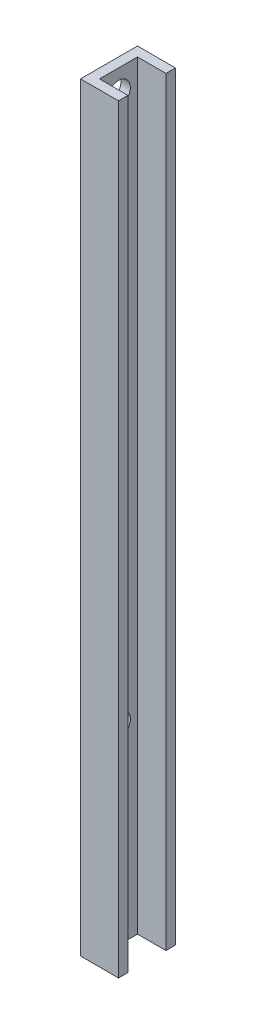
ISO-10303-21;
HEADER;
FILE_DESCRIPTION(('STEP AP214'),'2;1');
FILE_NAME('part.step','',(''),(''),'','','');
FILE_SCHEMA(('AUTOMOTIVE_DESIGN { 1 0 10303 214 1 1 1 1 }'));
ENDSEC;
DATA;
#1=APPLICATION_CONTEXT('core data for automotive mechanical design processes');
#2=APPLICATION_PROTOCOL_DEFINITION('international standard','automotive_design',2000,#1);
#3=PRODUCT_CONTEXT('',#1,'mechanical');
#4=PRODUCT('Part','Part','',(#3));
#5=PRODUCT_RELATED_PRODUCT_CATEGORY('part','',(#4));
#6=PRODUCT_DEFINITION_FORMATION('','',#4);
#7=PRODUCT_DEFINITION_CONTEXT('part definition',#1,'design');
#8=PRODUCT_DEFINITION('design','',#6,#7);
#9=PRODUCT_DEFINITION_SHAPE('','',#8);
#10=(LENGTH_UNIT() NAMED_UNIT(*) SI_UNIT(.MILLI.,.METRE.));
#11=(NAMED_UNIT(*) PLANE_ANGLE_UNIT() SI_UNIT($,.RADIAN.));
#12=(NAMED_UNIT(*) SI_UNIT($,.STERADIAN.) SOLID_ANGLE_UNIT());
#13=UNCERTAINTY_MEASURE_WITH_UNIT(LENGTH_MEASURE(1.E-05),#10,'distance_accuracy_value','');
#14=(GEOMETRIC_REPRESENTATION_CONTEXT(3) GLOBAL_UNCERTAINTY_ASSIGNED_CONTEXT((#13)) GLOBAL_UNIT_ASSIGNED_CONTEXT((#10,
#11,#12)) REPRESENTATION_CONTEXT('',''));
#15=CARTESIAN_POINT('',(0.,0.,0.));
#16=DIRECTION('',(0.,0.,1.));
#17=DIRECTION('',(1.,0.,0.));
#18=AXIS2_PLACEMENT_3D('',#15,#16,#17);
#19=CARTESIAN_POINT('',(0.,254.,-19.05));
#20=DIRECTION('',(1.,0.,0.));
#21=DIRECTION('',(0.,0.,-1.));
#22=AXIS2_PLACEMENT_3D('',#19,#20,#21);
#23=PLANE('',#22);
#24=CARTESIAN_POINT('',(0.,246.38,-9.525));
#25=DIRECTION('',(1.,0.,0.));
#26=DIRECTION('',(0.,0.,-1.));
#27=AXIS2_PLACEMENT_3D('',#24,#25,#26);
#28=CIRCLE('',#27,3.96875);
#29=CARTESIAN_POINT('',(0.,246.38,-13.49375));
#30=VERTEX_POINT('',#29);
#31=EDGE_CURVE('E182',#30,#30,#28,.T.);
#32=ORIENTED_EDGE('',*,*,#31,.T.);
#33=EDGE_LOOP('',(#32));
#34=FACE_BOUND('',#33,.T.);
#35=CARTESIAN_POINT('',(0.,63.5,-9.525));
#36=DIRECTION('',(1.,0.,0.));
#37=DIRECTION('',(0.,0.,-1.));
#38=AXIS2_PLACEMENT_3D('',#35,#36,#37);
#39=CIRCLE('',#38,3.96875);
#40=CARTESIAN_POINT('',(0.,63.5,-13.49375));
#41=VERTEX_POINT('',#40);
#42=EDGE_CURVE('E133',#41,#41,#39,.T.);
#43=ORIENTED_EDGE('',*,*,#42,.T.);
#44=EDGE_LOOP('',(#43));
#45=FACE_BOUND('',#44,.T.);
#46=DIRECTION('',(0.,0.,1.));
#47=VECTOR('',#46,1.);
#48=CARTESIAN_POINT('',(0.,0.,-19.05));
#49=LINE('',#48,#47);
#50=CARTESIAN_POINT('',(0.,0.,-19.05));
#51=VERTEX_POINT('',#50);
#52=CARTESIAN_POINT('',(0.,0.,0.));
#53=VERTEX_POINT('',#52);
#54=EDGE_CURVE('E129',#51,#53,#49,.T.);
#55=ORIENTED_EDGE('',*,*,#54,.T.);
#56=DIRECTION('',(0.,-1.,0.));
#57=VECTOR('',#56,1.);
#58=CARTESIAN_POINT('',(0.,254.,0.));
#59=LINE('',#58,#57);
#60=CARTESIAN_POINT('',(0.,254.,0.));
#61=VERTEX_POINT('',#60);
#62=EDGE_CURVE('E11',#61,#53,#59,.T.);
#63=ORIENTED_EDGE('',*,*,#62,.F.);
#64=DIRECTION('',(0.,0.,1.));
#65=VECTOR('',#64,1.);
#66=CARTESIAN_POINT('',(0.,254.,-19.05));
#67=LINE('',#66,#65);
#68=CARTESIAN_POINT('',(0.,254.,-19.05));
#69=VERTEX_POINT('',#68);
#70=EDGE_CURVE('E144',#69,#61,#67,.T.);
#71=ORIENTED_EDGE('',*,*,#70,.F.);
#72=DIRECTION('',(0.,-1.,0.));
#73=VECTOR('',#72,1.);
#74=CARTESIAN_POINT('',(0.,254.,-19.05));
#75=LINE('',#74,#73);
#76=EDGE_CURVE('E125',#69,#51,#75,.T.);
#77=ORIENTED_EDGE('',*,*,#76,.T.);
#78=EDGE_LOOP('',(#55,#63,#71,#77));
#79=FACE_BOUND('',#78,.T.);
#80=ADVANCED_FACE('F33',(#34,#45,#79),#23,.F.);
#81=CARTESIAN_POINT('',(0.,254.,0.));
#82=DIRECTION('',(0.,0.,-1.));
#83=DIRECTION('',(-1.,0.,0.));
#84=AXIS2_PLACEMENT_3D('',#81,#82,#83);
#85=PLANE('',#84);
#86=DIRECTION('',(1.,0.,0.));
#87=VECTOR('',#86,1.);
#88=CARTESIAN_POINT('',(0.,0.,0.));
#89=LINE('',#88,#87);
#90=CARTESIAN_POINT('',(12.7,0.,0.));
#91=VERTEX_POINT('',#90);
#92=EDGE_CURVE('E132',#53,#91,#89,.T.);
#93=ORIENTED_EDGE('',*,*,#92,.T.);
#94=DIRECTION('',(0.,-1.,0.));
#95=VECTOR('',#94,1.);
#96=CARTESIAN_POINT('',(12.7,254.,0.));
#97=LINE('',#96,#95);
#98=CARTESIAN_POINT('',(12.7,254.,0.));
#99=VERTEX_POINT('',#98);
#100=EDGE_CURVE('E41',#99,#91,#97,.T.);
#101=ORIENTED_EDGE('',*,*,#100,.F.);
#102=DIRECTION('',(1.,0.,0.));
#103=VECTOR('',#102,1.);
#104=CARTESIAN_POINT('',(0.,254.,0.));
#105=LINE('',#104,#103);
#106=EDGE_CURVE('E92',#61,#99,#105,.T.);
#107=ORIENTED_EDGE('',*,*,#106,.F.);
#108=ORIENTED_EDGE('',*,*,#62,.T.);
#109=EDGE_LOOP('',(#93,#101,#107,#108));
#110=FACE_BOUND('',#109,.T.);
#111=ADVANCED_FACE('F205',(#110),#85,.F.);
#112=CARTESIAN_POINT('',(12.7,254.,0.));
#113=DIRECTION('',(-1.,0.,0.));
#114=DIRECTION('',(0.,0.,1.));
#115=AXIS2_PLACEMENT_3D('',#112,#113,#114);
#116=PLANE('',#115);
#117=DIRECTION('',(0.,0.,-1.));
#118=VECTOR('',#117,1.);
#119=CARTESIAN_POINT('',(12.7,0.,0.));
#120=LINE('',#119,#118);
#121=CARTESIAN_POINT('',(12.7,0.,-3.175));
#122=VERTEX_POINT('',#121);
#123=EDGE_CURVE('E135',#91,#122,#120,.T.);
#124=ORIENTED_EDGE('',*,*,#123,.T.);
#125=DIRECTION('',(0.,-1.,0.));
#126=VECTOR('',#125,1.);
#127=CARTESIAN_POINT('',(12.7,254.,-3.175));
#128=LINE('',#127,#126);
#129=CARTESIAN_POINT('',(12.7,254.,-3.175));
#130=VERTEX_POINT('',#129);
#131=EDGE_CURVE('E151',#130,#122,#128,.T.);
#132=ORIENTED_EDGE('',*,*,#131,.F.);
#133=DIRECTION('',(0.,0.,-1.));
#134=VECTOR('',#133,1.);
#135=CARTESIAN_POINT('',(12.7,254.,0.));
#136=LINE('',#135,#134);
#137=EDGE_CURVE('E159',#99,#130,#136,.T.);
#138=ORIENTED_EDGE('',*,*,#137,.F.);
#139=ORIENTED_EDGE('',*,*,#100,.T.);
#140=EDGE_LOOP('',(#124,#132,#138,#139));
#141=FACE_BOUND('',#140,.T.);
#142=ADVANCED_FACE('F157',(#141),#116,.F.);
#143=CARTESIAN_POINT('',(12.7,254.,-3.175));
#144=DIRECTION('',(0.,0.,1.));
#145=DIRECTION('',(1.,0.,0.));
#146=AXIS2_PLACEMENT_3D('',#143,#144,#145);
#147=PLANE('',#146);
#148=DIRECTION('',(-1.,0.,0.));
#149=VECTOR('',#148,1.);
#150=CARTESIAN_POINT('',(12.7,0.,-3.175));
#151=LINE('',#150,#149);
#152=CARTESIAN_POINT('',(3.175,0.,-3.175));
#153=VERTEX_POINT('',#152);
#154=EDGE_CURVE('E137',#122,#153,#151,.T.);
#155=ORIENTED_EDGE('',*,*,#154,.T.);
#156=DIRECTION('',(0.,-1.,0.));
#157=VECTOR('',#156,1.);
#158=CARTESIAN_POINT('',(3.175,254.,-3.175));
#159=LINE('',#158,#157);
#160=CARTESIAN_POINT('',(3.175,254.,-3.175));
#161=VERTEX_POINT('',#160);
#162=EDGE_CURVE('E148',#161,#153,#159,.T.);
#163=ORIENTED_EDGE('',*,*,#162,.F.);
#164=DIRECTION('',(-1.,0.,0.));
#165=VECTOR('',#164,1.);
#166=CARTESIAN_POINT('',(12.7,254.,-3.175));
#167=LINE('',#166,#165);
#168=EDGE_CURVE('E171',#130,#161,#167,.T.);
#169=ORIENTED_EDGE('',*,*,#168,.F.);
#170=ORIENTED_EDGE('',*,*,#131,.T.);
#171=EDGE_LOOP('',(#155,#163,#169,#170));
#172=FACE_BOUND('',#171,.T.);
#173=ADVANCED_FACE('F167',(#172),#147,.F.);
#174=CARTESIAN_POINT('',(3.175,254.,-3.175));
#175=DIRECTION('',(-1.,0.,0.));
#176=DIRECTION('',(0.,0.,1.));
#177=AXIS2_PLACEMENT_3D('',#174,#175,#176);
#178=PLANE('',#177);
#179=CARTESIAN_POINT('',(3.175,246.38,-9.525));
#180=DIRECTION('',(1.,0.,0.));
#181=DIRECTION('',(0.,0.,-1.));
#182=AXIS2_PLACEMENT_3D('',#179,#180,#181);
#183=CIRCLE('',#182,3.96875);
#184=CARTESIAN_POINT('',(3.175,246.38,-13.49375));
#185=VERTEX_POINT('',#184);
#186=EDGE_CURVE('E185',#185,#185,#183,.T.);
#187=ORIENTED_EDGE('',*,*,#186,.F.);
#188=EDGE_LOOP('',(#187));
#189=FACE_BOUND('',#188,.T.);
#190=CARTESIAN_POINT('',(3.175,63.5,-9.525));
#191=DIRECTION('',(1.,0.,0.));
#192=DIRECTION('',(0.,0.,-1.));
#193=AXIS2_PLACEMENT_3D('',#190,#191,#192);
#194=CIRCLE('',#193,3.96875);
#195=CARTESIAN_POINT('',(3.175,63.5,-13.49375));
#196=VERTEX_POINT('',#195);
#197=EDGE_CURVE('E179',#196,#196,#194,.T.);
#198=ORIENTED_EDGE('',*,*,#197,.F.);
#199=EDGE_LOOP('',(#198));
#200=FACE_BOUND('',#199,.T.);
#201=DIRECTION('',(0.,0.,-1.));
#202=VECTOR('',#201,1.);
#203=CARTESIAN_POINT('',(3.175,0.,-3.175));
#204=LINE('',#203,#202);
#205=CARTESIAN_POINT('',(3.175,0.,-15.875));
#206=VERTEX_POINT('',#205);
#207=EDGE_CURVE('E139',#153,#206,#204,.T.);
#208=ORIENTED_EDGE('',*,*,#207,.T.);
#209=DIRECTION('',(0.,-1.,0.));
#210=VECTOR('',#209,1.);
#211=CARTESIAN_POINT('',(3.175,254.,-15.875));
#212=LINE('',#211,#210);
#213=CARTESIAN_POINT('',(3.175,254.,-15.875));
#214=VERTEX_POINT('',#213);
#215=EDGE_CURVE('E120',#214,#206,#212,.T.);
#216=ORIENTED_EDGE('',*,*,#215,.F.);
#217=DIRECTION('',(0.,0.,-1.));
#218=VECTOR('',#217,1.);
#219=CARTESIAN_POINT('',(3.175,254.,-3.175));
#220=LINE('',#219,#218);
#221=EDGE_CURVE('E111',#161,#214,#220,.T.);
#222=ORIENTED_EDGE('',*,*,#221,.F.);
#223=ORIENTED_EDGE('',*,*,#162,.T.);
#224=EDGE_LOOP('',(#208,#216,#222,#223));
#225=FACE_BOUND('',#224,.T.);
#226=ADVANCED_FACE('F170',(#189,#200,#225),#178,.F.);
#227=CARTESIAN_POINT('',(3.175,254.,-15.875));
#228=DIRECTION('',(0.,0.,-1.));
#229=DIRECTION('',(-1.,0.,0.));
#230=AXIS2_PLACEMENT_3D('',#227,#228,#229);
#231=PLANE('',#230);
#232=DIRECTION('',(1.,0.,0.));
#233=VECTOR('',#232,1.);
#234=CARTESIAN_POINT('',(3.175,0.,-15.875));
#235=LINE('',#234,#233);
#236=CARTESIAN_POINT('',(12.7,0.,-15.875));
#237=VERTEX_POINT('',#236);
#238=EDGE_CURVE('E119',#206,#237,#235,.T.);
#239=ORIENTED_EDGE('',*,*,#238,.T.);
#240=DIRECTION('',(0.,-1.,0.));
#241=VECTOR('',#240,1.);
#242=CARTESIAN_POINT('',(12.7,254.,-15.875));
#243=LINE('',#242,#241);
#244=CARTESIAN_POINT('',(12.7,254.,-15.875));
#245=VERTEX_POINT('',#244);
#246=EDGE_CURVE('E116',#245,#237,#243,.T.);
#247=ORIENTED_EDGE('',*,*,#246,.F.);
#248=DIRECTION('',(1.,0.,0.));
#249=VECTOR('',#248,1.);
#250=CARTESIAN_POINT('',(3.175,254.,-15.875));
#251=LINE('',#250,#249);
#252=EDGE_CURVE('E105',#214,#245,#251,.T.);
#253=ORIENTED_EDGE('',*,*,#252,.F.);
#254=ORIENTED_EDGE('',*,*,#215,.T.);
#255=EDGE_LOOP('',(#239,#247,#253,#254));
#256=FACE_BOUND('',#255,.T.);
#257=ADVANCED_FACE('F117',(#256),#231,.F.);
#258=CARTESIAN_POINT('',(12.7,254.,-15.875));
#259=DIRECTION('',(-1.,0.,0.));
#260=DIRECTION('',(0.,0.,1.));
#261=AXIS2_PLACEMENT_3D('',#258,#259,#260);
#262=PLANE('',#261);
#263=DIRECTION('',(0.,0.,-1.));
#264=VECTOR('',#263,1.);
#265=CARTESIAN_POINT('',(12.7,0.,-15.875));
#266=LINE('',#265,#264);
#267=CARTESIAN_POINT('',(12.7,0.,-19.05));
#268=VERTEX_POINT('',#267);
#269=EDGE_CURVE('E78',#237,#268,#266,.T.);
#270=ORIENTED_EDGE('',*,*,#269,.T.);
#271=DIRECTION('',(0.,-1.,0.));
#272=VECTOR('',#271,1.);
#273=CARTESIAN_POINT('',(12.7,254.,-19.05));
#274=LINE('',#273,#272);
#275=CARTESIAN_POINT('',(12.7,254.,-19.05));
#276=VERTEX_POINT('',#275);
#277=EDGE_CURVE('E121',#276,#268,#274,.T.);
#278=ORIENTED_EDGE('',*,*,#277,.F.);
#279=DIRECTION('',(0.,0.,-1.));
#280=VECTOR('',#279,1.);
#281=CARTESIAN_POINT('',(12.7,254.,-15.875));
#282=LINE('',#281,#280);
#283=EDGE_CURVE('E109',#245,#276,#282,.T.);
#284=ORIENTED_EDGE('',*,*,#283,.F.);
#285=ORIENTED_EDGE('',*,*,#246,.T.);
#286=EDGE_LOOP('',(#270,#278,#284,#285));
#287=FACE_BOUND('',#286,.T.);
#288=ADVANCED_FACE('F123',(#287),#262,.F.);
#289=CARTESIAN_POINT('',(12.7,254.,-19.05));
#290=DIRECTION('',(0.,0.,1.));
#291=DIRECTION('',(1.,0.,0.));
#292=AXIS2_PLACEMENT_3D('',#289,#290,#291);
#293=PLANE('',#292);
#294=DIRECTION('',(-1.,0.,0.));
#295=VECTOR('',#294,1.);
#296=CARTESIAN_POINT('',(12.7,0.,-19.05));
#297=LINE('',#296,#295);
#298=EDGE_CURVE('E84',#268,#51,#297,.T.);
#299=ORIENTED_EDGE('',*,*,#298,.T.);
#300=ORIENTED_EDGE('',*,*,#76,.F.);
#301=DIRECTION('',(-1.,0.,0.));
#302=VECTOR('',#301,1.);
#303=CARTESIAN_POINT('',(12.7,254.,-19.05));
#304=LINE('',#303,#302);
#305=EDGE_CURVE('E49',#276,#69,#304,.T.);
#306=ORIENTED_EDGE('',*,*,#305,.F.);
#307=ORIENTED_EDGE('',*,*,#277,.T.);
#308=EDGE_LOOP('',(#299,#300,#306,#307));
#309=FACE_BOUND('',#308,.T.);
#310=ADVANCED_FACE('F209',(#309),#293,.F.);
#311=CARTESIAN_POINT('',(0.,254.,0.));
#312=DIRECTION('',(0.,1.,0.));
#313=DIRECTION('',(0.,0.,1.));
#314=AXIS2_PLACEMENT_3D('',#311,#312,#313);
#315=PLANE('',#314);
#316=ORIENTED_EDGE('',*,*,#70,.T.);
#317=ORIENTED_EDGE('',*,*,#106,.T.);
#318=ORIENTED_EDGE('',*,*,#137,.T.);
#319=ORIENTED_EDGE('',*,*,#168,.T.);
#320=ORIENTED_EDGE('',*,*,#221,.T.);
#321=ORIENTED_EDGE('',*,*,#252,.T.);
#322=ORIENTED_EDGE('',*,*,#283,.T.);
#323=ORIENTED_EDGE('',*,*,#305,.T.);
#324=EDGE_LOOP('',(#316,#317,#318,#319,#320,#321,#322,#323));
#325=FACE_BOUND('',#324,.T.);
#326=ADVANCED_FACE('F107',(#325),#315,.T.);
#327=CARTESIAN_POINT('',(0.,0.,0.));
#328=DIRECTION('',(0.,1.,0.));
#329=DIRECTION('',(0.,0.,1.));
#330=AXIS2_PLACEMENT_3D('',#327,#328,#329);
#331=PLANE('',#330);
#332=ORIENTED_EDGE('',*,*,#54,.F.);
#333=ORIENTED_EDGE('',*,*,#298,.F.);
#334=ORIENTED_EDGE('',*,*,#269,.F.);
#335=ORIENTED_EDGE('',*,*,#238,.F.);
#336=ORIENTED_EDGE('',*,*,#207,.F.);
#337=ORIENTED_EDGE('',*,*,#154,.F.);
#338=ORIENTED_EDGE('',*,*,#123,.F.);
#339=ORIENTED_EDGE('',*,*,#92,.F.);
#340=EDGE_LOOP('',(#332,#333,#334,#335,#336,#337,#338,#339));
#341=FACE_BOUND('',#340,.T.);
#342=ADVANCED_FACE('F163',(#341),#331,.F.);
#343=CARTESIAN_POINT('',(-9.525,63.5,-9.525));
#344=DIRECTION('',(1.,0.,0.));
#345=DIRECTION('',(0.,0.,-1.));
#346=AXIS2_PLACEMENT_3D('',#343,#344,#345);
#347=CYLINDRICAL_SURFACE('',#346,3.96875);
#348=ORIENTED_EDGE('',*,*,#197,.T.);
#349=EDGE_LOOP('',(#348));
#350=FACE_BOUND('',#349,.T.);
#351=ORIENTED_EDGE('',*,*,#42,.F.);
#352=EDGE_LOOP('',(#351));
#353=FACE_BOUND('',#352,.T.);
#354=ADVANCED_FACE('F197',(#350,#353),#347,.F.);
#355=CARTESIAN_POINT('',(-9.525,246.38,-9.525));
#356=DIRECTION('',(1.,0.,0.));
#357=DIRECTION('',(0.,0.,-1.));
#358=AXIS2_PLACEMENT_3D('',#355,#356,#357);
#359=CYLINDRICAL_SURFACE('',#358,3.96875);
#360=ORIENTED_EDGE('',*,*,#186,.T.);
#361=EDGE_LOOP('',(#360));
#362=FACE_BOUND('',#361,.T.);
#363=ORIENTED_EDGE('',*,*,#31,.F.);
#364=EDGE_LOOP('',(#363));
#365=FACE_BOUND('',#364,.T.);
#366=ADVANCED_FACE('F189',(#362,#365),#359,.F.);
#367=CLOSED_SHELL('',(#80,#111,#142,#173,#226,#257,#288,#310,#326,#342,#354,#366));
#368=MANIFOLD_SOLID_BREP('B2',#367);
#369=ADVANCED_BREP_SHAPE_REPRESENTATION('',(#18,#368),#14);
#370=SHAPE_DEFINITION_REPRESENTATION(#9,#369);
ENDSEC;
END-ISO-10303-21;
